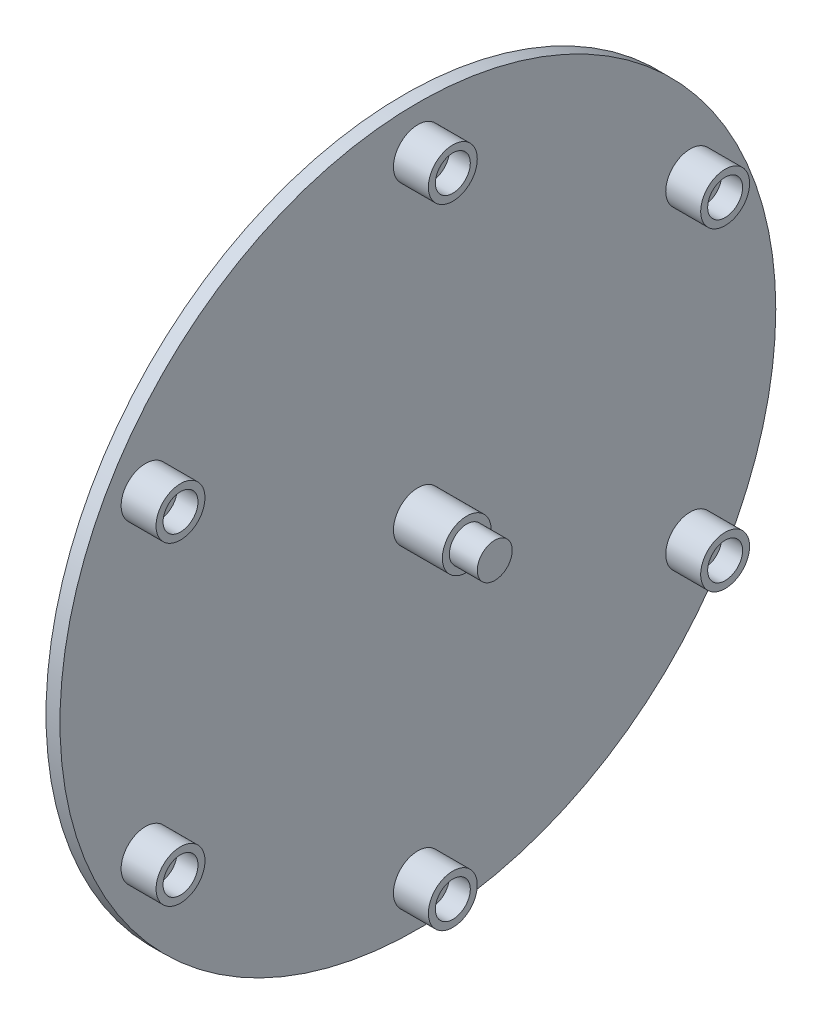
ISO-10303-21;
HEADER;
FILE_DESCRIPTION(('STEP AP214'),'2;1');
FILE_NAME('part.step','',(''),(''),'','','');
FILE_SCHEMA(('AUTOMOTIVE_DESIGN { 1 0 10303 214 1 1 1 1 }'));
ENDSEC;
DATA;
#1=APPLICATION_CONTEXT('core data for automotive mechanical design processes');
#2=APPLICATION_PROTOCOL_DEFINITION('international standard','automotive_design',2000,#1);
#3=PRODUCT_CONTEXT('',#1,'mechanical');
#4=PRODUCT('Part','Part','',(#3));
#5=PRODUCT_RELATED_PRODUCT_CATEGORY('part','',(#4));
#6=PRODUCT_DEFINITION_FORMATION('','',#4);
#7=PRODUCT_DEFINITION_CONTEXT('part definition',#1,'design');
#8=PRODUCT_DEFINITION('design','',#6,#7);
#9=PRODUCT_DEFINITION_SHAPE('','',#8);
#10=(LENGTH_UNIT() NAMED_UNIT(*) SI_UNIT(.MILLI.,.METRE.));
#11=(NAMED_UNIT(*) PLANE_ANGLE_UNIT() SI_UNIT($,.RADIAN.));
#12=(NAMED_UNIT(*) SI_UNIT($,.STERADIAN.) SOLID_ANGLE_UNIT());
#13=UNCERTAINTY_MEASURE_WITH_UNIT(LENGTH_MEASURE(1.E-05),#10,'distance_accuracy_value','');
#14=(GEOMETRIC_REPRESENTATION_CONTEXT(3) GLOBAL_UNCERTAINTY_ASSIGNED_CONTEXT((#13)) GLOBAL_UNIT_ASSIGNED_CONTEXT((#10,
#11,#12)) REPRESENTATION_CONTEXT('',''));
#15=CARTESIAN_POINT('',(0.,0.,0.));
#16=DIRECTION('',(0.,0.,1.));
#17=DIRECTION('',(1.,0.,0.));
#18=AXIS2_PLACEMENT_3D('',#15,#16,#17);
#19=CARTESIAN_POINT('',(2.,0.,0.));
#20=DIRECTION('',(-1.,0.,0.));
#21=DIRECTION('',(0.,0.,1.));
#22=AXIS2_PLACEMENT_3D('',#19,#20,#21);
#23=CYLINDRICAL_SURFACE('',#22,51.2209407248549);
#24=CARTESIAN_POINT('',(2.,0.,0.));
#25=DIRECTION('',(1.,0.,0.));
#26=DIRECTION('',(0.,0.,-1.));
#27=AXIS2_PLACEMENT_3D('',#24,#25,#26);
#28=CIRCLE('',#27,51.2209407248549);
#29=CARTESIAN_POINT('',(2.,0.,-51.2209407248549));
#30=VERTEX_POINT('',#29);
#31=EDGE_CURVE('E45',#30,#30,#28,.T.);
#32=ORIENTED_EDGE('',*,*,#31,.F.);
#33=EDGE_LOOP('',(#32));
#34=FACE_BOUND('',#33,.T.);
#35=CARTESIAN_POINT('',(0.,0.,0.));
#36=DIRECTION('',(1.,0.,0.));
#37=DIRECTION('',(0.,0.,-1.));
#38=AXIS2_PLACEMENT_3D('',#35,#36,#37);
#39=CIRCLE('',#38,51.2209407248549);
#40=CARTESIAN_POINT('',(0.,0.,-51.2209407248549));
#41=VERTEX_POINT('',#40);
#42=EDGE_CURVE('E49',#41,#41,#39,.T.);
#43=ORIENTED_EDGE('',*,*,#42,.T.);
#44=EDGE_LOOP('',(#43));
#45=FACE_BOUND('',#44,.T.);
#46=ADVANCED_FACE('F39',(#34,#45),#23,.T.);
#47=CARTESIAN_POINT('',(2.,0.,0.));
#48=DIRECTION('',(1.,0.,0.));
#49=DIRECTION('',(0.,0.,-1.));
#50=AXIS2_PLACEMENT_3D('',#47,#48,#49);
#51=PLANE('',#50);
#52=CARTESIAN_POINT('',(2.,0.,0.));
#53=DIRECTION('',(1.,0.,0.));
#54=DIRECTION('',(0.,0.,-1.));
#55=AXIS2_PLACEMENT_3D('',#52,#53,#54);
#56=CIRCLE('',#55,3.5);
#57=CARTESIAN_POINT('',(2.,0.,-3.5));
#58=VERTEX_POINT('',#57);
#59=EDGE_CURVE('E71',#58,#58,#56,.T.);
#60=ORIENTED_EDGE('',*,*,#59,.F.);
#61=EDGE_LOOP('',(#60));
#62=FACE_BOUND('',#61,.T.);
#63=CARTESIAN_POINT('',(2.,22.5000000000005,38.9711431702995));
#64=DIRECTION('',(1.,0.,0.));
#65=DIRECTION('',(0.,0.866025403784433,-0.50000000000001));
#66=AXIS2_PLACEMENT_3D('',#63,#64,#65);
#67=CIRCLE('',#66,3.5);
#68=CARTESIAN_POINT('',(2.,25.531088913246,37.2211431702994));
#69=VERTEX_POINT('',#68);
#70=EDGE_CURVE('E123',#69,#69,#67,.T.);
#71=ORIENTED_EDGE('',*,*,#70,.F.);
#72=EDGE_LOOP('',(#71));
#73=FACE_BOUND('',#72,.T.);
#74=CARTESIAN_POINT('',(2.,-22.4999999999996,38.9711431702999));
#75=DIRECTION('',(1.,0.,0.));
#76=DIRECTION('',(0.,0.866025403784443,0.499999999999992));
#77=AXIS2_PLACEMENT_3D('',#74,#75,#76);
#78=CIRCLE('',#77,3.5);
#79=CARTESIAN_POINT('',(2.,-19.4689110867541,40.7211431702999));
#80=VERTEX_POINT('',#79);
#81=EDGE_CURVE('E129',#80,#80,#78,.T.);
#82=ORIENTED_EDGE('',*,*,#81,.F.);
#83=EDGE_LOOP('',(#82));
#84=FACE_BOUND('',#83,.T.);
#85=CARTESIAN_POINT('',(2.,-45.,0.));
#86=DIRECTION('',(1.,0.,0.));
#87=DIRECTION('',(0.,0.,1.));
#88=AXIS2_PLACEMENT_3D('',#85,#86,#87);
#89=CIRCLE('',#88,3.5);
#90=CARTESIAN_POINT('',(2.,-45.,3.5));
#91=VERTEX_POINT('',#90);
#92=EDGE_CURVE('E135',#91,#91,#89,.T.);
#93=ORIENTED_EDGE('',*,*,#92,.F.);
#94=EDGE_LOOP('',(#93));
#95=FACE_BOUND('',#94,.T.);
#96=CARTESIAN_POINT('',(2.,-22.5000000000002,-38.9711431702996));
#97=DIRECTION('',(1.,0.,0.));
#98=DIRECTION('',(0.,-0.866025403784436,0.500000000000004));
#99=AXIS2_PLACEMENT_3D('',#96,#97,#98);
#100=CIRCLE('',#99,3.5);
#101=CARTESIAN_POINT('',(2.,-25.5310889132457,-37.2211431702996));
#102=VERTEX_POINT('',#101);
#103=EDGE_CURVE('E141',#102,#102,#100,.T.);
#104=ORIENTED_EDGE('',*,*,#103,.F.);
#105=EDGE_LOOP('',(#104));
#106=FACE_BOUND('',#105,.T.);
#107=CARTESIAN_POINT('',(2.,22.4999999999999,-38.9711431702998));
#108=DIRECTION('',(1.,0.,0.));
#109=DIRECTION('',(0.,-0.86602540378444,-0.499999999999998));
#110=AXIS2_PLACEMENT_3D('',#107,#108,#109);
#111=CIRCLE('',#110,3.5);
#112=CARTESIAN_POINT('',(2.,19.4689110867544,-40.7211431702998));
#113=VERTEX_POINT('',#112);
#114=EDGE_CURVE('E147',#113,#113,#111,.T.);
#115=ORIENTED_EDGE('',*,*,#114,.F.);
#116=EDGE_LOOP('',(#115));
#117=FACE_BOUND('',#116,.T.);
#118=CARTESIAN_POINT('',(2.,45.,0.));
#119=DIRECTION('',(1.,0.,0.));
#120=DIRECTION('',(0.,0.,-1.));
#121=AXIS2_PLACEMENT_3D('',#118,#119,#120);
#122=CIRCLE('',#121,3.5);
#123=CARTESIAN_POINT('',(2.,45.,-3.5));
#124=VERTEX_POINT('',#123);
#125=EDGE_CURVE('E57',#124,#124,#122,.T.);
#126=ORIENTED_EDGE('',*,*,#125,.F.);
#127=EDGE_LOOP('',(#126));
#128=FACE_BOUND('',#127,.T.);
#129=ORIENTED_EDGE('',*,*,#31,.T.);
#130=EDGE_LOOP('',(#129));
#131=FACE_BOUND('',#130,.T.);
#132=ADVANCED_FACE('F162',(#62,#73,#84,#95,#106,#117,#128,#131),#51,.T.);
#133=CARTESIAN_POINT('',(0.,0.,0.));
#134=DIRECTION('',(1.,0.,0.));
#135=DIRECTION('',(0.,0.,-1.));
#136=AXIS2_PLACEMENT_3D('',#133,#134,#135);
#137=PLANE('',#136);
#138=CARTESIAN_POINT('',(0.,0.,0.));
#139=DIRECTION('',(1.,0.,0.));
#140=DIRECTION('',(0.,0.,-1.));
#141=AXIS2_PLACEMENT_3D('',#138,#139,#140);
#142=CIRCLE('',#141,6.);
#143=CARTESIAN_POINT('',(0.,0.,-6.));
#144=VERTEX_POINT('',#143);
#145=EDGE_CURVE('E10',#144,#144,#142,.F.);
#146=ORIENTED_EDGE('',*,*,#145,.F.);
#147=EDGE_LOOP('',(#146));
#148=FACE_BOUND('',#147,.T.);
#149=ORIENTED_EDGE('',*,*,#42,.F.);
#150=EDGE_LOOP('',(#149));
#151=FACE_BOUND('',#150,.T.);
#152=ADVANCED_FACE('F164',(#148,#151),#137,.F.);
#153=CARTESIAN_POINT('',(7.,45.,0.));
#154=DIRECTION('',(-1.,0.,0.));
#155=DIRECTION('',(0.,0.,1.));
#156=AXIS2_PLACEMENT_3D('',#153,#154,#155);
#157=CYLINDRICAL_SURFACE('',#156,3.5);
#158=CARTESIAN_POINT('',(7.,45.,0.));
#159=DIRECTION('',(1.,0.,0.));
#160=DIRECTION('',(0.,0.,-1.));
#161=AXIS2_PLACEMENT_3D('',#158,#159,#160);
#162=CIRCLE('',#161,3.5);
#163=CARTESIAN_POINT('',(7.,45.,-3.5));
#164=VERTEX_POINT('',#163);
#165=EDGE_CURVE('E54',#164,#164,#162,.T.);
#166=ORIENTED_EDGE('',*,*,#165,.F.);
#167=EDGE_LOOP('',(#166));
#168=FACE_BOUND('',#167,.T.);
#169=ORIENTED_EDGE('',*,*,#125,.T.);
#170=EDGE_LOOP('',(#169));
#171=FACE_BOUND('',#170,.T.);
#172=ADVANCED_FACE('F160',(#168,#171),#157,.T.);
#173=CARTESIAN_POINT('',(7.,45.,0.));
#174=DIRECTION('',(1.,0.,0.));
#175=DIRECTION('',(0.,0.,-1.));
#176=AXIS2_PLACEMENT_3D('',#173,#174,#175);
#177=PLANE('',#176);
#178=CARTESIAN_POINT('',(7.,45.,0.));
#179=DIRECTION('',(1.,0.,0.));
#180=DIRECTION('',(0.,0.,-1.));
#181=AXIS2_PLACEMENT_3D('',#178,#179,#180);
#182=CIRCLE('',#181,2.5);
#183=CARTESIAN_POINT('',(7.,45.,-2.5));
#184=VERTEX_POINT('',#183);
#185=EDGE_CURVE('E117',#184,#184,#182,.T.);
#186=ORIENTED_EDGE('',*,*,#185,.F.);
#187=EDGE_LOOP('',(#186));
#188=FACE_BOUND('',#187,.T.);
#189=ORIENTED_EDGE('',*,*,#165,.T.);
#190=EDGE_LOOP('',(#189));
#191=FACE_BOUND('',#190,.T.);
#192=ADVANCED_FACE('F180',(#188,#191),#177,.T.);
#193=CARTESIAN_POINT('',(7.,22.4999999999999,-38.9711431702998));
#194=DIRECTION('',(-1.,0.,0.));
#195=DIRECTION('',(0.,0.,1.));
#196=AXIS2_PLACEMENT_3D('',#193,#194,#195);
#197=CYLINDRICAL_SURFACE('',#196,3.5);
#198=CARTESIAN_POINT('',(7.,22.4999999999999,-38.9711431702998));
#199=DIRECTION('',(1.,0.,0.));
#200=DIRECTION('',(0.,-0.86602540378444,-0.499999999999998));
#201=AXIS2_PLACEMENT_3D('',#198,#199,#200);
#202=CIRCLE('',#201,3.5);
#203=CARTESIAN_POINT('',(7.,19.4689110867544,-40.7211431702998));
#204=VERTEX_POINT('',#203);
#205=EDGE_CURVE('E150',#204,#204,#202,.T.);
#206=ORIENTED_EDGE('',*,*,#205,.F.);
#207=EDGE_LOOP('',(#206));
#208=FACE_BOUND('',#207,.T.);
#209=ORIENTED_EDGE('',*,*,#114,.T.);
#210=EDGE_LOOP('',(#209));
#211=FACE_BOUND('',#210,.T.);
#212=ADVANCED_FACE('F184',(#208,#211),#197,.T.);
#213=CARTESIAN_POINT('',(7.,22.4999999999999,-38.9711431702998));
#214=DIRECTION('',(1.,0.,0.));
#215=DIRECTION('',(0.,-0.86602540378444,-0.499999999999998));
#216=AXIS2_PLACEMENT_3D('',#213,#214,#215);
#217=PLANE('',#216);
#218=CARTESIAN_POINT('',(7.,22.4999999999999,-38.9711431702998));
#219=DIRECTION('',(1.,0.,0.));
#220=DIRECTION('',(0.,-0.86602540378444,-0.499999999999998));
#221=AXIS2_PLACEMENT_3D('',#218,#219,#220);
#222=CIRCLE('',#221,2.5);
#223=CARTESIAN_POINT('',(7.,20.3349364905388,-40.2211431702998));
#224=VERTEX_POINT('',#223);
#225=EDGE_CURVE('E93',#224,#224,#222,.T.);
#226=ORIENTED_EDGE('',*,*,#225,.F.);
#227=EDGE_LOOP('',(#226));
#228=FACE_BOUND('',#227,.T.);
#229=ORIENTED_EDGE('',*,*,#205,.T.);
#230=EDGE_LOOP('',(#229));
#231=FACE_BOUND('',#230,.T.);
#232=ADVANCED_FACE('F188',(#228,#231),#217,.T.);
#233=CARTESIAN_POINT('',(7.,-22.5000000000002,-38.9711431702996));
#234=DIRECTION('',(-1.,0.,0.));
#235=DIRECTION('',(0.,0.,1.));
#236=AXIS2_PLACEMENT_3D('',#233,#234,#235);
#237=CYLINDRICAL_SURFACE('',#236,3.5);
#238=CARTESIAN_POINT('',(7.,-22.5000000000002,-38.9711431702996));
#239=DIRECTION('',(1.,0.,0.));
#240=DIRECTION('',(0.,-0.866025403784436,0.500000000000004));
#241=AXIS2_PLACEMENT_3D('',#238,#239,#240);
#242=CIRCLE('',#241,3.5);
#243=CARTESIAN_POINT('',(7.,-25.5310889132457,-37.2211431702996));
#244=VERTEX_POINT('',#243);
#245=EDGE_CURVE('E144',#244,#244,#242,.T.);
#246=ORIENTED_EDGE('',*,*,#245,.F.);
#247=EDGE_LOOP('',(#246));
#248=FACE_BOUND('',#247,.T.);
#249=ORIENTED_EDGE('',*,*,#103,.T.);
#250=EDGE_LOOP('',(#249));
#251=FACE_BOUND('',#250,.T.);
#252=ADVANCED_FACE('F192',(#248,#251),#237,.T.);
#253=CARTESIAN_POINT('',(7.,-22.5000000000002,-38.9711431702996));
#254=DIRECTION('',(1.,0.,0.));
#255=DIRECTION('',(0.,-0.866025403784436,0.500000000000004));
#256=AXIS2_PLACEMENT_3D('',#253,#254,#255);
#257=PLANE('',#256);
#258=CARTESIAN_POINT('',(7.,-22.5000000000002,-38.9711431702996));
#259=DIRECTION('',(1.,0.,0.));
#260=DIRECTION('',(0.,-0.866025403784436,0.500000000000004));
#261=AXIS2_PLACEMENT_3D('',#258,#259,#260);
#262=CIRCLE('',#261,2.5);
#263=CARTESIAN_POINT('',(7.,-24.6650635094613,-37.7211431702996));
#264=VERTEX_POINT('',#263);
#265=EDGE_CURVE('E94',#264,#264,#262,.T.);
#266=ORIENTED_EDGE('',*,*,#265,.F.);
#267=EDGE_LOOP('',(#266));
#268=FACE_BOUND('',#267,.T.);
#269=ORIENTED_EDGE('',*,*,#245,.T.);
#270=EDGE_LOOP('',(#269));
#271=FACE_BOUND('',#270,.T.);
#272=ADVANCED_FACE('F196',(#268,#271),#257,.T.);
#273=CARTESIAN_POINT('',(7.,-45.,0.));
#274=DIRECTION('',(-1.,0.,0.));
#275=DIRECTION('',(0.,0.,1.));
#276=AXIS2_PLACEMENT_3D('',#273,#274,#275);
#277=CYLINDRICAL_SURFACE('',#276,3.5);
#278=CARTESIAN_POINT('',(7.,-45.,0.));
#279=DIRECTION('',(1.,0.,0.));
#280=DIRECTION('',(0.,0.,1.));
#281=AXIS2_PLACEMENT_3D('',#278,#279,#280);
#282=CIRCLE('',#281,3.5);
#283=CARTESIAN_POINT('',(7.,-45.,3.5));
#284=VERTEX_POINT('',#283);
#285=EDGE_CURVE('E138',#284,#284,#282,.T.);
#286=ORIENTED_EDGE('',*,*,#285,.F.);
#287=EDGE_LOOP('',(#286));
#288=FACE_BOUND('',#287,.T.);
#289=ORIENTED_EDGE('',*,*,#92,.T.);
#290=EDGE_LOOP('',(#289));
#291=FACE_BOUND('',#290,.T.);
#292=ADVANCED_FACE('F200',(#288,#291),#277,.T.);
#293=CARTESIAN_POINT('',(7.,-45.,0.));
#294=DIRECTION('',(1.,0.,0.));
#295=DIRECTION('',(0.,0.,1.));
#296=AXIS2_PLACEMENT_3D('',#293,#294,#295);
#297=PLANE('',#296);
#298=CARTESIAN_POINT('',(7.,-45.,0.));
#299=DIRECTION('',(1.,0.,0.));
#300=DIRECTION('',(0.,0.,1.));
#301=AXIS2_PLACEMENT_3D('',#298,#299,#300);
#302=CIRCLE('',#301,2.5);
#303=CARTESIAN_POINT('',(7.,-45.,2.5));
#304=VERTEX_POINT('',#303);
#305=EDGE_CURVE('E100',#304,#304,#302,.T.);
#306=ORIENTED_EDGE('',*,*,#305,.F.);
#307=EDGE_LOOP('',(#306));
#308=FACE_BOUND('',#307,.T.);
#309=ORIENTED_EDGE('',*,*,#285,.T.);
#310=EDGE_LOOP('',(#309));
#311=FACE_BOUND('',#310,.T.);
#312=ADVANCED_FACE('F204',(#308,#311),#297,.T.);
#313=CARTESIAN_POINT('',(7.,-22.4999999999996,38.9711431702999));
#314=DIRECTION('',(-1.,0.,0.));
#315=DIRECTION('',(0.,0.,1.));
#316=AXIS2_PLACEMENT_3D('',#313,#314,#315);
#317=CYLINDRICAL_SURFACE('',#316,3.5);
#318=CARTESIAN_POINT('',(7.,-22.4999999999996,38.9711431702999));
#319=DIRECTION('',(1.,0.,0.));
#320=DIRECTION('',(0.,0.866025403784443,0.499999999999992));
#321=AXIS2_PLACEMENT_3D('',#318,#319,#320);
#322=CIRCLE('',#321,3.5);
#323=CARTESIAN_POINT('',(7.,-19.4689110867541,40.7211431702999));
#324=VERTEX_POINT('',#323);
#325=EDGE_CURVE('E132',#324,#324,#322,.T.);
#326=ORIENTED_EDGE('',*,*,#325,.F.);
#327=EDGE_LOOP('',(#326));
#328=FACE_BOUND('',#327,.T.);
#329=ORIENTED_EDGE('',*,*,#81,.T.);
#330=EDGE_LOOP('',(#329));
#331=FACE_BOUND('',#330,.T.);
#332=ADVANCED_FACE('F208',(#328,#331),#317,.T.);
#333=CARTESIAN_POINT('',(7.,-22.4999999999996,38.9711431702999));
#334=DIRECTION('',(1.,0.,0.));
#335=DIRECTION('',(0.,0.866025403784443,0.499999999999992));
#336=AXIS2_PLACEMENT_3D('',#333,#334,#335);
#337=PLANE('',#336);
#338=CARTESIAN_POINT('',(7.,-22.4999999999996,38.9711431702999));
#339=DIRECTION('',(1.,0.,0.));
#340=DIRECTION('',(0.,0.866025403784443,0.499999999999992));
#341=AXIS2_PLACEMENT_3D('',#338,#339,#340);
#342=CIRCLE('',#341,2.5);
#343=CARTESIAN_POINT('',(7.,-20.3349364905385,40.2211431702999));
#344=VERTEX_POINT('',#343);
#345=EDGE_CURVE('E106',#344,#344,#342,.T.);
#346=ORIENTED_EDGE('',*,*,#345,.F.);
#347=EDGE_LOOP('',(#346));
#348=FACE_BOUND('',#347,.T.);
#349=ORIENTED_EDGE('',*,*,#325,.T.);
#350=EDGE_LOOP('',(#349));
#351=FACE_BOUND('',#350,.T.);
#352=ADVANCED_FACE('F212',(#348,#351),#337,.T.);
#353=CARTESIAN_POINT('',(7.,22.5000000000005,38.9711431702995));
#354=DIRECTION('',(-1.,0.,0.));
#355=DIRECTION('',(0.,0.,1.));
#356=AXIS2_PLACEMENT_3D('',#353,#354,#355);
#357=CYLINDRICAL_SURFACE('',#356,3.5);
#358=CARTESIAN_POINT('',(7.,22.5000000000005,38.9711431702995));
#359=DIRECTION('',(1.,0.,0.));
#360=DIRECTION('',(0.,0.866025403784433,-0.50000000000001));
#361=AXIS2_PLACEMENT_3D('',#358,#359,#360);
#362=CIRCLE('',#361,3.5);
#363=CARTESIAN_POINT('',(7.,25.531088913246,37.2211431702994));
#364=VERTEX_POINT('',#363);
#365=EDGE_CURVE('E126',#364,#364,#362,.T.);
#366=ORIENTED_EDGE('',*,*,#365,.F.);
#367=EDGE_LOOP('',(#366));
#368=FACE_BOUND('',#367,.T.);
#369=ORIENTED_EDGE('',*,*,#70,.T.);
#370=EDGE_LOOP('',(#369));
#371=FACE_BOUND('',#370,.T.);
#372=ADVANCED_FACE('F216',(#368,#371),#357,.T.);
#373=CARTESIAN_POINT('',(7.,22.5000000000005,38.9711431702995));
#374=DIRECTION('',(1.,0.,0.));
#375=DIRECTION('',(0.,0.866025403784433,-0.50000000000001));
#376=AXIS2_PLACEMENT_3D('',#373,#374,#375);
#377=PLANE('',#376);
#378=CARTESIAN_POINT('',(7.,22.5000000000005,38.9711431702995));
#379=DIRECTION('',(1.,0.,0.));
#380=DIRECTION('',(0.,0.866025403784433,-0.50000000000001));
#381=AXIS2_PLACEMENT_3D('',#378,#379,#380);
#382=CIRCLE('',#381,2.5);
#383=CARTESIAN_POINT('',(7.,24.6650635094615,37.7211431702994));
#384=VERTEX_POINT('',#383);
#385=EDGE_CURVE('E89',#384,#384,#382,.T.);
#386=ORIENTED_EDGE('',*,*,#385,.F.);
#387=EDGE_LOOP('',(#386));
#388=FACE_BOUND('',#387,.T.);
#389=ORIENTED_EDGE('',*,*,#365,.T.);
#390=EDGE_LOOP('',(#389));
#391=FACE_BOUND('',#390,.T.);
#392=ADVANCED_FACE('F220',(#388,#391),#377,.T.);
#393=CARTESIAN_POINT('',(4.,45.,0.));
#394=DIRECTION('',(1.,0.,0.));
#395=DIRECTION('',(0.,0.,-1.));
#396=AXIS2_PLACEMENT_3D('',#393,#394,#395);
#397=CYLINDRICAL_SURFACE('',#396,2.5);
#398=CARTESIAN_POINT('',(4.,45.,0.));
#399=DIRECTION('',(1.,0.,0.));
#400=DIRECTION('',(0.,0.,-1.));
#401=AXIS2_PLACEMENT_3D('',#398,#399,#400);
#402=CIRCLE('',#401,2.5);
#403=CARTESIAN_POINT('',(4.,45.,-2.5));
#404=VERTEX_POINT('',#403);
#405=EDGE_CURVE('E120',#404,#404,#402,.T.);
#406=ORIENTED_EDGE('',*,*,#405,.F.);
#407=EDGE_LOOP('',(#406));
#408=FACE_BOUND('',#407,.T.);
#409=ORIENTED_EDGE('',*,*,#185,.T.);
#410=EDGE_LOOP('',(#409));
#411=FACE_BOUND('',#410,.T.);
#412=ADVANCED_FACE('F224',(#408,#411),#397,.F.);
#413=CARTESIAN_POINT('',(4.,45.,0.));
#414=DIRECTION('',(1.,0.,0.));
#415=DIRECTION('',(0.,0.,-1.));
#416=AXIS2_PLACEMENT_3D('',#413,#414,#415);
#417=PLANE('',#416);
#418=ORIENTED_EDGE('',*,*,#405,.T.);
#419=EDGE_LOOP('',(#418));
#420=FACE_BOUND('',#419,.T.);
#421=ADVANCED_FACE('F228',(#420),#417,.T.);
#422=CARTESIAN_POINT('',(4.,22.5000000000005,38.9711431702995));
#423=DIRECTION('',(1.,0.,0.));
#424=DIRECTION('',(0.,0.,-1.));
#425=AXIS2_PLACEMENT_3D('',#422,#423,#424);
#426=CYLINDRICAL_SURFACE('',#425,2.5);
#427=CARTESIAN_POINT('',(4.,22.5000000000005,38.9711431702995));
#428=DIRECTION('',(1.,0.,0.));
#429=DIRECTION('',(0.,0.866025403784433,-0.50000000000001));
#430=AXIS2_PLACEMENT_3D('',#427,#428,#429);
#431=CIRCLE('',#430,2.5);
#432=CARTESIAN_POINT('',(4.,24.6650635094615,37.7211431702994));
#433=VERTEX_POINT('',#432);
#434=EDGE_CURVE('E109',#433,#433,#431,.T.);
#435=ORIENTED_EDGE('',*,*,#434,.F.);
#436=EDGE_LOOP('',(#435));
#437=FACE_BOUND('',#436,.T.);
#438=ORIENTED_EDGE('',*,*,#385,.T.);
#439=EDGE_LOOP('',(#438));
#440=FACE_BOUND('',#439,.T.);
#441=ADVANCED_FACE('F232',(#437,#440),#426,.F.);
#442=CARTESIAN_POINT('',(4.,22.5000000000005,38.9711431702995));
#443=DIRECTION('',(1.,0.,0.));
#444=DIRECTION('',(0.,0.866025403784433,-0.50000000000001));
#445=AXIS2_PLACEMENT_3D('',#442,#443,#444);
#446=PLANE('',#445);
#447=ORIENTED_EDGE('',*,*,#434,.T.);
#448=EDGE_LOOP('',(#447));
#449=FACE_BOUND('',#448,.T.);
#450=ADVANCED_FACE('F246',(#449),#446,.T.);
#451=CARTESIAN_POINT('',(4.,-22.4999999999996,38.9711431702999));
#452=DIRECTION('',(1.,0.,0.));
#453=DIRECTION('',(0.,0.,-1.));
#454=AXIS2_PLACEMENT_3D('',#451,#452,#453);
#455=CYLINDRICAL_SURFACE('',#454,2.5);
#456=CARTESIAN_POINT('',(4.,-22.4999999999996,38.9711431702999));
#457=DIRECTION('',(1.,0.,0.));
#458=DIRECTION('',(0.,0.866025403784443,0.499999999999992));
#459=AXIS2_PLACEMENT_3D('',#456,#457,#458);
#460=CIRCLE('',#459,2.5);
#461=CARTESIAN_POINT('',(4.,-20.3349364905385,40.2211431702999));
#462=VERTEX_POINT('',#461);
#463=EDGE_CURVE('E103',#462,#462,#460,.T.);
#464=ORIENTED_EDGE('',*,*,#463,.F.);
#465=EDGE_LOOP('',(#464));
#466=FACE_BOUND('',#465,.T.);
#467=ORIENTED_EDGE('',*,*,#345,.T.);
#468=EDGE_LOOP('',(#467));
#469=FACE_BOUND('',#468,.T.);
#470=ADVANCED_FACE('F250',(#466,#469),#455,.F.);
#471=CARTESIAN_POINT('',(4.,-22.4999999999996,38.9711431702999));
#472=DIRECTION('',(1.,0.,0.));
#473=DIRECTION('',(0.,0.866025403784443,0.499999999999992));
#474=AXIS2_PLACEMENT_3D('',#471,#472,#473);
#475=PLANE('',#474);
#476=ORIENTED_EDGE('',*,*,#463,.T.);
#477=EDGE_LOOP('',(#476));
#478=FACE_BOUND('',#477,.T.);
#479=ADVANCED_FACE('F254',(#478),#475,.T.);
#480=CARTESIAN_POINT('',(4.,-45.,0.));
#481=DIRECTION('',(1.,0.,0.));
#482=DIRECTION('',(0.,0.,-1.));
#483=AXIS2_PLACEMENT_3D('',#480,#481,#482);
#484=CYLINDRICAL_SURFACE('',#483,2.5);
#485=CARTESIAN_POINT('',(4.,-45.,0.));
#486=DIRECTION('',(1.,0.,0.));
#487=DIRECTION('',(0.,0.,1.));
#488=AXIS2_PLACEMENT_3D('',#485,#486,#487);
#489=CIRCLE('',#488,2.5);
#490=CARTESIAN_POINT('',(4.,-45.,2.5));
#491=VERTEX_POINT('',#490);
#492=EDGE_CURVE('E97',#491,#491,#489,.T.);
#493=ORIENTED_EDGE('',*,*,#492,.F.);
#494=EDGE_LOOP('',(#493));
#495=FACE_BOUND('',#494,.T.);
#496=ORIENTED_EDGE('',*,*,#305,.T.);
#497=EDGE_LOOP('',(#496));
#498=FACE_BOUND('',#497,.T.);
#499=ADVANCED_FACE('F258',(#495,#498),#484,.F.);
#500=CARTESIAN_POINT('',(4.,-45.,0.));
#501=DIRECTION('',(1.,0.,0.));
#502=DIRECTION('',(0.,0.,1.));
#503=AXIS2_PLACEMENT_3D('',#500,#501,#502);
#504=PLANE('',#503);
#505=ORIENTED_EDGE('',*,*,#492,.T.);
#506=EDGE_LOOP('',(#505));
#507=FACE_BOUND('',#506,.T.);
#508=ADVANCED_FACE('F262',(#507),#504,.T.);
#509=CARTESIAN_POINT('',(4.,-22.5000000000002,-38.9711431702996));
#510=DIRECTION('',(1.,0.,0.));
#511=DIRECTION('',(0.,0.,-1.));
#512=AXIS2_PLACEMENT_3D('',#509,#510,#511);
#513=CYLINDRICAL_SURFACE('',#512,2.5);
#514=CARTESIAN_POINT('',(4.,-22.5000000000002,-38.9711431702996));
#515=DIRECTION('',(1.,0.,0.));
#516=DIRECTION('',(0.,-0.866025403784436,0.500000000000004));
#517=AXIS2_PLACEMENT_3D('',#514,#515,#516);
#518=CIRCLE('',#517,2.5);
#519=CARTESIAN_POINT('',(4.,-24.6650635094613,-37.7211431702996));
#520=VERTEX_POINT('',#519);
#521=EDGE_CURVE('E90',#520,#520,#518,.T.);
#522=ORIENTED_EDGE('',*,*,#521,.F.);
#523=EDGE_LOOP('',(#522));
#524=FACE_BOUND('',#523,.T.);
#525=ORIENTED_EDGE('',*,*,#265,.T.);
#526=EDGE_LOOP('',(#525));
#527=FACE_BOUND('',#526,.T.);
#528=ADVANCED_FACE('F266',(#524,#527),#513,.F.);
#529=CARTESIAN_POINT('',(4.,-22.5000000000002,-38.9711431702996));
#530=DIRECTION('',(1.,0.,0.));
#531=DIRECTION('',(0.,-0.866025403784436,0.500000000000004));
#532=AXIS2_PLACEMENT_3D('',#529,#530,#531);
#533=PLANE('',#532);
#534=ORIENTED_EDGE('',*,*,#521,.T.);
#535=EDGE_LOOP('',(#534));
#536=FACE_BOUND('',#535,.T.);
#537=ADVANCED_FACE('F238',(#536),#533,.T.);
#538=CARTESIAN_POINT('',(4.,22.4999999999999,-38.9711431702998));
#539=DIRECTION('',(1.,0.,0.));
#540=DIRECTION('',(0.,0.,-1.));
#541=AXIS2_PLACEMENT_3D('',#538,#539,#540);
#542=CYLINDRICAL_SURFACE('',#541,2.5);
#543=CARTESIAN_POINT('',(4.,22.4999999999999,-38.9711431702998));
#544=DIRECTION('',(1.,0.,0.));
#545=DIRECTION('',(0.,-0.86602540378444,-0.499999999999998));
#546=AXIS2_PLACEMENT_3D('',#543,#544,#545);
#547=CIRCLE('',#546,2.5);
#548=CARTESIAN_POINT('',(4.,20.3349364905388,-40.2211431702998));
#549=VERTEX_POINT('',#548);
#550=EDGE_CURVE('E114',#549,#549,#547,.T.);
#551=ORIENTED_EDGE('',*,*,#550,.F.);
#552=EDGE_LOOP('',(#551));
#553=FACE_BOUND('',#552,.T.);
#554=ORIENTED_EDGE('',*,*,#225,.T.);
#555=EDGE_LOOP('',(#554));
#556=FACE_BOUND('',#555,.T.);
#557=ADVANCED_FACE('F234',(#553,#556),#542,.F.);
#558=CARTESIAN_POINT('',(4.,22.4999999999999,-38.9711431702998));
#559=DIRECTION('',(1.,0.,0.));
#560=DIRECTION('',(0.,-0.86602540378444,-0.499999999999998));
#561=AXIS2_PLACEMENT_3D('',#558,#559,#560);
#562=PLANE('',#561);
#563=ORIENTED_EDGE('',*,*,#550,.T.);
#564=EDGE_LOOP('',(#563));
#565=FACE_BOUND('',#564,.T.);
#566=ADVANCED_FACE('F237',(#565),#562,.T.);
#567=CARTESIAN_POINT('',(9.,0.,0.));
#568=DIRECTION('',(-1.,0.,0.));
#569=DIRECTION('',(0.,0.,1.));
#570=AXIS2_PLACEMENT_3D('',#567,#568,#569);
#571=CYLINDRICAL_SURFACE('',#570,3.5);
#572=CARTESIAN_POINT('',(9.,0.,0.));
#573=DIRECTION('',(1.,0.,0.));
#574=DIRECTION('',(0.,0.,-1.));
#575=AXIS2_PLACEMENT_3D('',#572,#573,#574);
#576=CIRCLE('',#575,3.5);
#577=CARTESIAN_POINT('',(9.,0.,-3.5));
#578=VERTEX_POINT('',#577);
#579=EDGE_CURVE('E63',#578,#578,#576,.T.);
#580=ORIENTED_EDGE('',*,*,#579,.F.);
#581=EDGE_LOOP('',(#580));
#582=FACE_BOUND('',#581,.T.);
#583=ORIENTED_EDGE('',*,*,#59,.T.);
#584=EDGE_LOOP('',(#583));
#585=FACE_BOUND('',#584,.T.);
#586=ADVANCED_FACE('F242',(#582,#585),#571,.T.);
#587=CARTESIAN_POINT('',(9.,0.,0.));
#588=DIRECTION('',(1.,0.,0.));
#589=DIRECTION('',(0.,0.,-1.));
#590=AXIS2_PLACEMENT_3D('',#587,#588,#589);
#591=PLANE('',#590);
#592=CARTESIAN_POINT('',(9.,0.,0.));
#593=DIRECTION('',(1.,0.,0.));
#594=DIRECTION('',(0.,0.,-1.));
#595=AXIS2_PLACEMENT_3D('',#592,#593,#594);
#596=CIRCLE('',#595,2.5);
#597=CARTESIAN_POINT('',(9.,0.,-2.5));
#598=VERTEX_POINT('',#597);
#599=EDGE_CURVE('E60',#598,#598,#596,.T.);
#600=ORIENTED_EDGE('',*,*,#599,.F.);
#601=EDGE_LOOP('',(#600));
#602=FACE_BOUND('',#601,.T.);
#603=ORIENTED_EDGE('',*,*,#579,.T.);
#604=EDGE_LOOP('',(#603));
#605=FACE_BOUND('',#604,.T.);
#606=ADVANCED_FACE('F281',(#602,#605),#591,.T.);
#607=CARTESIAN_POINT('',(13.,0.,0.));
#608=DIRECTION('',(1.,0.,0.));
#609=DIRECTION('',(0.,0.,-1.));
#610=AXIS2_PLACEMENT_3D('',#607,#608,#609);
#611=PLANE('',#610);
#612=CARTESIAN_POINT('',(13.,0.,0.));
#613=DIRECTION('',(1.,0.,0.));
#614=DIRECTION('',(0.,0.,-1.));
#615=AXIS2_PLACEMENT_3D('',#612,#613,#614);
#616=CIRCLE('',#615,2.5);
#617=CARTESIAN_POINT('',(13.,0.,-2.5));
#618=VERTEX_POINT('',#617);
#619=EDGE_CURVE('E62',#618,#618,#616,.T.);
#620=ORIENTED_EDGE('',*,*,#619,.T.);
#621=EDGE_LOOP('',(#620));
#622=FACE_BOUND('',#621,.T.);
#623=ADVANCED_FACE('F278',(#622),#611,.T.);
#624=CARTESIAN_POINT('',(13.,0.,0.));
#625=DIRECTION('',(-1.,0.,0.));
#626=DIRECTION('',(0.,0.,1.));
#627=AXIS2_PLACEMENT_3D('',#624,#625,#626);
#628=CYLINDRICAL_SURFACE('',#627,2.5);
#629=ORIENTED_EDGE('',*,*,#599,.T.);
#630=EDGE_LOOP('',(#629));
#631=FACE_BOUND('',#630,.T.);
#632=ORIENTED_EDGE('',*,*,#619,.F.);
#633=EDGE_LOOP('',(#632));
#634=FACE_BOUND('',#633,.T.);
#635=ADVANCED_FACE('F274',(#631,#634),#628,.T.);
#636=CARTESIAN_POINT('',(-5.,0.,0.));
#637=DIRECTION('',(1.,0.,0.));
#638=DIRECTION('',(0.,0.,-1.));
#639=AXIS2_PLACEMENT_3D('',#636,#637,#638);
#640=CYLINDRICAL_SURFACE('',#639,6.);
#641=CARTESIAN_POINT('',(-5.,0.,0.));
#642=DIRECTION('',(-1.,0.,0.));
#643=DIRECTION('',(0.,0.,1.));
#644=AXIS2_PLACEMENT_3D('',#641,#642,#643);
#645=CIRCLE('',#644,6.);
#646=CARTESIAN_POINT('',(-5.,0.,6.));
#647=VERTEX_POINT('',#646);
#648=EDGE_CURVE('E67',#647,#647,#645,.T.);
#649=ORIENTED_EDGE('',*,*,#648,.F.);
#650=EDGE_LOOP('',(#649));
#651=FACE_BOUND('',#650,.T.);
#652=ORIENTED_EDGE('',*,*,#145,.T.);
#653=EDGE_LOOP('',(#652));
#654=FACE_BOUND('',#653,.T.);
#655=ADVANCED_FACE('F277',(#651,#654),#640,.T.);
#656=CARTESIAN_POINT('',(-5.,0.,0.));
#657=DIRECTION('',(-1.,0.,0.));
#658=DIRECTION('',(0.,0.,1.));
#659=AXIS2_PLACEMENT_3D('',#656,#657,#658);
#660=PLANE('',#659);
#661=CARTESIAN_POINT('',(-5.,0.,0.));
#662=DIRECTION('',(-1.,0.,0.));
#663=DIRECTION('',(0.,0.,1.));
#664=AXIS2_PLACEMENT_3D('',#661,#662,#663);
#665=CIRCLE('',#664,5.);
#666=CARTESIAN_POINT('',(-5.,0.,5.));
#667=VERTEX_POINT('',#666);
#668=EDGE_CURVE('E64',#667,#667,#665,.T.);
#669=ORIENTED_EDGE('',*,*,#668,.F.);
#670=EDGE_LOOP('',(#669));
#671=FACE_BOUND('',#670,.T.);
#672=ORIENTED_EDGE('',*,*,#648,.T.);
#673=EDGE_LOOP('',(#672));
#674=FACE_BOUND('',#673,.T.);
#675=ADVANCED_FACE('F295',(#671,#674),#660,.T.);
#676=CARTESIAN_POINT('',(-20.,0.,0.));
#677=DIRECTION('',(-1.,0.,0.));
#678=DIRECTION('',(0.,0.,1.));
#679=AXIS2_PLACEMENT_3D('',#676,#677,#678);
#680=PLANE('',#679);
#681=CARTESIAN_POINT('',(-20.,0.,0.));
#682=DIRECTION('',(-1.,0.,0.));
#683=DIRECTION('',(0.,0.,1.));
#684=AXIS2_PLACEMENT_3D('',#681,#682,#683);
#685=CIRCLE('',#684,2.5);
#686=CARTESIAN_POINT('',(-20.,0.,2.5));
#687=VERTEX_POINT('',#686);
#688=EDGE_CURVE('E79',#687,#687,#685,.T.);
#689=ORIENTED_EDGE('',*,*,#688,.F.);
#690=EDGE_LOOP('',(#689));
#691=FACE_BOUND('',#690,.T.);
#692=CARTESIAN_POINT('',(-20.,0.,0.));
#693=DIRECTION('',(-1.,0.,0.));
#694=DIRECTION('',(0.,0.,1.));
#695=AXIS2_PLACEMENT_3D('',#692,#693,#694);
#696=CIRCLE('',#695,5.);
#697=CARTESIAN_POINT('',(-20.,0.,5.));
#698=VERTEX_POINT('',#697);
#699=EDGE_CURVE('E66',#698,#698,#696,.T.);
#700=ORIENTED_EDGE('',*,*,#699,.T.);
#701=EDGE_LOOP('',(#700));
#702=FACE_BOUND('',#701,.T.);
#703=ADVANCED_FACE('F292',(#691,#702),#680,.T.);
#704=CARTESIAN_POINT('',(-20.,0.,0.));
#705=DIRECTION('',(1.,0.,0.));
#706=DIRECTION('',(0.,0.,-1.));
#707=AXIS2_PLACEMENT_3D('',#704,#705,#706);
#708=CYLINDRICAL_SURFACE('',#707,5.);
#709=ORIENTED_EDGE('',*,*,#668,.T.);
#710=EDGE_LOOP('',(#709));
#711=FACE_BOUND('',#710,.T.);
#712=ORIENTED_EDGE('',*,*,#699,.F.);
#713=EDGE_LOOP('',(#712));
#714=FACE_BOUND('',#713,.T.);
#715=ADVANCED_FACE('F288',(#711,#714),#708,.T.);
#716=CARTESIAN_POINT('',(-13.,0.,0.));
#717=DIRECTION('',(-1.,0.,0.));
#718=DIRECTION('',(0.,0.,1.));
#719=AXIS2_PLACEMENT_3D('',#716,#717,#718);
#720=CYLINDRICAL_SURFACE('',#719,2.5);
#721=CARTESIAN_POINT('',(-13.,0.,0.));
#722=DIRECTION('',(-1.,0.,0.));
#723=DIRECTION('',(0.,0.,1.));
#724=AXIS2_PLACEMENT_3D('',#721,#722,#723);
#725=CIRCLE('',#724,2.5);
#726=CARTESIAN_POINT('',(-13.,0.,2.5));
#727=VERTEX_POINT('',#726);
#728=EDGE_CURVE('E74',#727,#727,#725,.T.);
#729=ORIENTED_EDGE('',*,*,#728,.F.);
#730=EDGE_LOOP('',(#729));
#731=FACE_BOUND('',#730,.T.);
#732=ORIENTED_EDGE('',*,*,#688,.T.);
#733=EDGE_LOOP('',(#732));
#734=FACE_BOUND('',#733,.T.);
#735=ADVANCED_FACE('F291',(#731,#734),#720,.F.);
#736=CARTESIAN_POINT('',(-13.,0.,0.));
#737=DIRECTION('',(-1.,0.,0.));
#738=DIRECTION('',(0.,0.,1.));
#739=AXIS2_PLACEMENT_3D('',#736,#737,#738);
#740=PLANE('',#739);
#741=ORIENTED_EDGE('',*,*,#728,.T.);
#742=EDGE_LOOP('',(#741));
#743=FACE_BOUND('',#742,.T.);
#744=ADVANCED_FACE('F305',(#743),#740,.T.);
#745=CLOSED_SHELL('',(#46,#132,#152,#172,#192,#212,#232,#252,#272,#292,#312,#332,#352,#372,#392,
#412,#421,#441,#450,#470,#479,#499,#508,#528,#537,#557,#566,#586,#606,#623,#635,#655,#675,#703,
#715,#735,#744));
#746=MANIFOLD_SOLID_BREP('B2',#745);
#747=ADVANCED_BREP_SHAPE_REPRESENTATION('',(#18,#746),#14);
#748=SHAPE_DEFINITION_REPRESENTATION(#9,#747);
ENDSEC;
END-ISO-10303-21;
